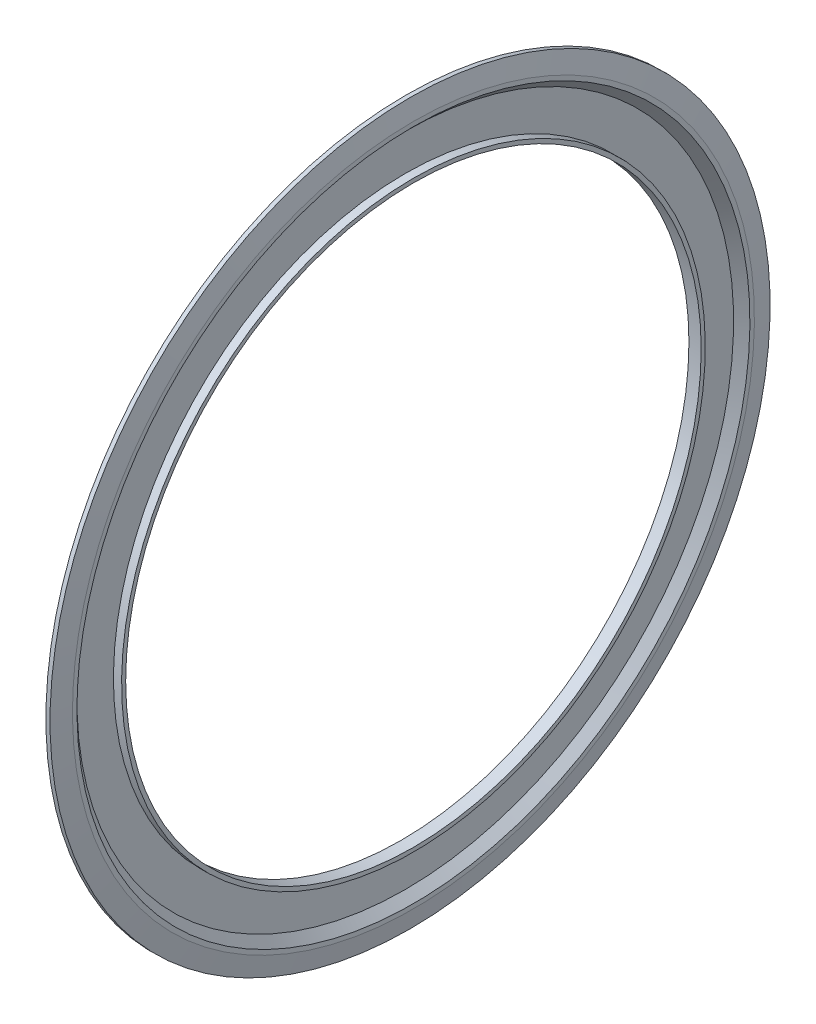
ISO-10303-21;
HEADER;
FILE_DESCRIPTION(('STEP AP214'),'2;1');
FILE_NAME('part.step','',(''),(''),'','','');
FILE_SCHEMA(('AUTOMOTIVE_DESIGN { 1 0 10303 214 1 1 1 1 }'));
ENDSEC;
DATA;
#1=APPLICATION_CONTEXT('core data for automotive mechanical design processes');
#2=APPLICATION_PROTOCOL_DEFINITION('international standard','automotive_design',2000,#1);
#3=PRODUCT_CONTEXT('',#1,'mechanical');
#4=PRODUCT('Part','Part','',(#3));
#5=PRODUCT_RELATED_PRODUCT_CATEGORY('part','',(#4));
#6=PRODUCT_DEFINITION_FORMATION('','',#4);
#7=PRODUCT_DEFINITION_CONTEXT('part definition',#1,'design');
#8=PRODUCT_DEFINITION('design','',#6,#7);
#9=PRODUCT_DEFINITION_SHAPE('','',#8);
#10=(LENGTH_UNIT() NAMED_UNIT(*) SI_UNIT(.MILLI.,.METRE.));
#11=(NAMED_UNIT(*) PLANE_ANGLE_UNIT() SI_UNIT($,.RADIAN.));
#12=(NAMED_UNIT(*) SI_UNIT($,.STERADIAN.) SOLID_ANGLE_UNIT());
#13=UNCERTAINTY_MEASURE_WITH_UNIT(LENGTH_MEASURE(1.E-05),#10,'distance_accuracy_value','');
#14=(GEOMETRIC_REPRESENTATION_CONTEXT(3) GLOBAL_UNCERTAINTY_ASSIGNED_CONTEXT((#13)) GLOBAL_UNIT_ASSIGNED_CONTEXT((#10,
#11,#12)) REPRESENTATION_CONTEXT('',''));
#15=CARTESIAN_POINT('',(0.,0.,0.));
#16=DIRECTION('',(0.,0.,1.));
#17=DIRECTION('',(1.,0.,0.));
#18=AXIS2_PLACEMENT_3D('',#15,#16,#17);
#19=CARTESIAN_POINT('',(0.498800475508444,10.58,0.));
#20=DIRECTION('',(1.,0.,0.));
#21=DIRECTION('',(0.,-1.,0.));
#22=AXIS2_PLACEMENT_3D('',#19,#20,#21);
#23=PLANE('',#22);
#24=CARTESIAN_POINT('',(0.498800475508444,0.,0.));
#25=DIRECTION('',(-1.,0.,0.));
#26=DIRECTION('',(0.,1.,0.));
#27=AXIS2_PLACEMENT_3D('',#24,#25,#26);
#28=CIRCLE('',#27,10.51);
#29=CARTESIAN_POINT('',(0.498800475508444,10.51,0.));
#30=VERTEX_POINT('',#29);
#31=EDGE_CURVE('E11',#30,#30,#28,.T.);
#32=ORIENTED_EDGE('',*,*,#31,.T.);
#33=EDGE_LOOP('',(#32));
#34=FACE_BOUND('',#33,.T.);
#35=CARTESIAN_POINT('',(0.498800475508444,0.,0.));
#36=DIRECTION('',(-1.,0.,0.));
#37=DIRECTION('',(0.,1.,0.));
#38=AXIS2_PLACEMENT_3D('',#35,#36,#37);
#39=CIRCLE('',#38,10.65);
#40=CARTESIAN_POINT('',(0.498800475508444,10.65,0.));
#41=VERTEX_POINT('',#40);
#42=EDGE_CURVE('E70',#41,#41,#39,.T.);
#43=ORIENTED_EDGE('',*,*,#42,.F.);
#44=EDGE_LOOP('',(#43));
#45=FACE_BOUND('',#44,.T.);
#46=ADVANCED_FACE('F16',(#34,#45),#23,.T.);
#47=CARTESIAN_POINT('',(0.371300475508445,0.,0.));
#48=DIRECTION('',(1.,0.,0.));
#49=DIRECTION('',(0.,1.,0.));
#50=AXIS2_PLACEMENT_3D('',#47,#48,#49);
#51=CONICAL_SURFACE('',#50,10.3825,0.785398163397449);
#52=CARTESIAN_POINT('',(0.243800475508445,0.,0.));
#53=DIRECTION('',(-1.,0.,0.));
#54=DIRECTION('',(0.,1.,0.));
#55=AXIS2_PLACEMENT_3D('',#52,#53,#54);
#56=CIRCLE('',#55,10.255);
#57=CARTESIAN_POINT('',(0.243800475508445,10.255,0.));
#58=VERTEX_POINT('',#57);
#59=EDGE_CURVE('E25',#58,#58,#56,.T.);
#60=ORIENTED_EDGE('',*,*,#59,.T.);
#61=EDGE_LOOP('',(#60));
#62=FACE_BOUND('',#61,.T.);
#63=ORIENTED_EDGE('',*,*,#31,.F.);
#64=EDGE_LOOP('',(#63));
#65=FACE_BOUND('',#64,.T.);
#66=ADVANCED_FACE('F88',(#62,#65),#51,.F.);
#67=CARTESIAN_POINT('',(0.243800475508445,9.685,0.));
#68=DIRECTION('',(1.,0.,0.));
#69=DIRECTION('',(0.,-1.,0.));
#70=AXIS2_PLACEMENT_3D('',#67,#68,#69);
#71=PLANE('',#70);
#72=CARTESIAN_POINT('',(0.243800475508445,0.,0.));
#73=DIRECTION('',(-1.,0.,0.));
#74=DIRECTION('',(0.,1.,0.));
#75=AXIS2_PLACEMENT_3D('',#72,#73,#74);
#76=CIRCLE('',#75,9.115);
#77=CARTESIAN_POINT('',(0.243800475508445,9.115,0.));
#78=VERTEX_POINT('',#77);
#79=EDGE_CURVE('E55',#78,#78,#76,.T.);
#80=ORIENTED_EDGE('',*,*,#79,.T.);
#81=EDGE_LOOP('',(#80));
#82=FACE_BOUND('',#81,.T.);
#83=ORIENTED_EDGE('',*,*,#59,.F.);
#84=EDGE_LOOP('',(#83));
#85=FACE_BOUND('',#84,.T.);
#86=ADVANCED_FACE('F91',(#82,#85),#71,.T.);
#87=CARTESIAN_POINT('',(0.371300475508445,0.,0.));
#88=DIRECTION('',(1.,0.,0.));
#89=DIRECTION('',(0.,1.,0.));
#90=AXIS2_PLACEMENT_3D('',#87,#88,#89);
#91=CYLINDRICAL_SURFACE('',#90,9.115);
#92=CARTESIAN_POINT('',(0.498800475508444,0.,0.));
#93=DIRECTION('',(-1.,0.,0.));
#94=DIRECTION('',(0.,1.,0.));
#95=AXIS2_PLACEMENT_3D('',#92,#93,#94);
#96=CIRCLE('',#95,9.115);
#97=CARTESIAN_POINT('',(0.498800475508444,9.115,0.));
#98=VERTEX_POINT('',#97);
#99=EDGE_CURVE('E59',#98,#98,#96,.T.);
#100=ORIENTED_EDGE('',*,*,#99,.T.);
#101=EDGE_LOOP('',(#100));
#102=FACE_BOUND('',#101,.T.);
#103=ORIENTED_EDGE('',*,*,#79,.F.);
#104=EDGE_LOOP('',(#103));
#105=FACE_BOUND('',#104,.T.);
#106=ADVANCED_FACE('F93',(#102,#105),#91,.T.);
#107=CARTESIAN_POINT('',(0.498800475508444,9.05125,0.));
#108=DIRECTION('',(1.,0.,0.));
#109=DIRECTION('',(0.,-1.,0.));
#110=AXIS2_PLACEMENT_3D('',#107,#108,#109);
#111=PLANE('',#110);
#112=CARTESIAN_POINT('',(0.498800475508444,0.,0.));
#113=DIRECTION('',(-1.,0.,0.));
#114=DIRECTION('',(0.,1.,0.));
#115=AXIS2_PLACEMENT_3D('',#112,#113,#114);
#116=CIRCLE('',#115,8.9875);
#117=CARTESIAN_POINT('',(0.498800475508444,8.9875,0.));
#118=VERTEX_POINT('',#117);
#119=EDGE_CURVE('E83',#118,#118,#116,.T.);
#120=ORIENTED_EDGE('',*,*,#119,.T.);
#121=EDGE_LOOP('',(#120));
#122=FACE_BOUND('',#121,.T.);
#123=ORIENTED_EDGE('',*,*,#99,.F.);
#124=EDGE_LOOP('',(#123));
#125=FACE_BOUND('',#124,.T.);
#126=ADVANCED_FACE('F100',(#122,#125),#111,.T.);
#127=CARTESIAN_POINT('',(0.307550475508445,0.,0.));
#128=DIRECTION('',(1.,0.,0.));
#129=DIRECTION('',(0.,1.,0.));
#130=AXIS2_PLACEMENT_3D('',#127,#128,#129);
#131=CYLINDRICAL_SURFACE('',#130,8.9875);
#132=CARTESIAN_POINT('',(0.116300475508445,0.,0.));
#133=DIRECTION('',(-1.,0.,0.));
#134=DIRECTION('',(0.,1.,0.));
#135=AXIS2_PLACEMENT_3D('',#132,#133,#134);
#136=CIRCLE('',#135,8.9875);
#137=CARTESIAN_POINT('',(0.116300475508445,8.9875,0.));
#138=VERTEX_POINT('',#137);
#139=EDGE_CURVE('E81',#138,#138,#136,.T.);
#140=ORIENTED_EDGE('',*,*,#139,.T.);
#141=EDGE_LOOP('',(#140));
#142=FACE_BOUND('',#141,.T.);
#143=ORIENTED_EDGE('',*,*,#119,.F.);
#144=EDGE_LOOP('',(#143));
#145=FACE_BOUND('',#144,.T.);
#146=ADVANCED_FACE('F135',(#142,#145),#131,.F.);
#147=CARTESIAN_POINT('',(0.116300475508446,9.64765611460129,0.));
#148=DIRECTION('',(-1.,0.,0.));
#149=DIRECTION('',(0.,1.,0.));
#150=AXIS2_PLACEMENT_3D('',#147,#148,#149);
#151=PLANE('',#150);
#152=CARTESIAN_POINT('',(0.116300475508446,0.,0.));
#153=DIRECTION('',(-1.,0.,0.));
#154=DIRECTION('',(0.,1.,0.));
#155=AXIS2_PLACEMENT_3D('',#152,#153,#154);
#156=CIRCLE('',#155,10.3078122292026);
#157=CARTESIAN_POINT('',(0.116300475508446,10.3078122292026,0.));
#158=VERTEX_POINT('',#157);
#159=EDGE_CURVE('E84',#158,#158,#156,.T.);
#160=ORIENTED_EDGE('',*,*,#159,.T.);
#161=EDGE_LOOP('',(#160));
#162=FACE_BOUND('',#161,.T.);
#163=ORIENTED_EDGE('',*,*,#139,.F.);
#164=EDGE_LOOP('',(#163));
#165=FACE_BOUND('',#164,.T.);
#166=ADVANCED_FACE('F145',(#162,#165),#151,.T.);
#167=CARTESIAN_POINT('',(0.243800475508445,0.,0.));
#168=DIRECTION('',(1.,0.,0.));
#169=DIRECTION('',(0.,1.,0.));
#170=AXIS2_PLACEMENT_3D('',#167,#168,#169);
#171=CONICAL_SURFACE('',#170,10.4353122292026,0.785398163397449);
#172=CARTESIAN_POINT('',(0.371300475508445,0.,0.));
#173=DIRECTION('',(-1.,0.,0.));
#174=DIRECTION('',(0.,1.,0.));
#175=AXIS2_PLACEMENT_3D('',#172,#173,#174);
#176=CIRCLE('',#175,10.5628122292026);
#177=CARTESIAN_POINT('',(0.371300475508445,10.5628122292026,0.));
#178=VERTEX_POINT('',#177);
#179=EDGE_CURVE('E210',#178,#178,#176,.T.);
#180=ORIENTED_EDGE('',*,*,#179,.T.);
#181=EDGE_LOOP('',(#180));
#182=FACE_BOUND('',#181,.T.);
#183=ORIENTED_EDGE('',*,*,#159,.F.);
#184=EDGE_LOOP('',(#183));
#185=FACE_BOUND('',#184,.T.);
#186=ADVANCED_FACE('F155',(#182,#185),#171,.T.);
#187=CARTESIAN_POINT('',(0.371300475508445,10.6008287123015,0.));
#188=DIRECTION('',(-1.,0.,0.));
#189=DIRECTION('',(0.,1.,0.));
#190=AXIS2_PLACEMENT_3D('',#187,#188,#189);
#191=PLANE('',#190);
#192=CARTESIAN_POINT('',(0.371300475508445,0.,0.));
#193=DIRECTION('',(-1.,0.,0.));
#194=DIRECTION('',(0.,1.,0.));
#195=AXIS2_PLACEMENT_3D('',#192,#193,#194);
#196=CIRCLE('',#195,10.6388451954004);
#197=CARTESIAN_POINT('',(0.371300475508445,10.6388451954004,0.));
#198=VERTEX_POINT('',#197);
#199=EDGE_CURVE('E19',#198,#198,#196,.T.);
#200=ORIENTED_EDGE('',*,*,#199,.T.);
#201=EDGE_LOOP('',(#200));
#202=FACE_BOUND('',#201,.T.);
#203=ORIENTED_EDGE('',*,*,#179,.F.);
#204=EDGE_LOOP('',(#203));
#205=FACE_BOUND('',#204,.T.);
#206=ADVANCED_FACE('F165',(#202,#205),#191,.T.);
#207=CARTESIAN_POINT('',(0.31785975223996,0.,0.));
#208=DIRECTION('',(-1.,0.,0.));
#209=DIRECTION('',(0.,1.,0.));
#210=AXIS2_PLACEMENT_3D('',#207,#208,#209);
#211=CONICAL_SURFACE('',#210,10.9419225977002,1.39626340159546);
#212=CARTESIAN_POINT('',(0.264419028971476,0.,0.));
#213=DIRECTION('',(-1.,0.,0.));
#214=DIRECTION('',(0.,1.,0.));
#215=AXIS2_PLACEMENT_3D('',#212,#213,#214);
#216=CIRCLE('',#215,11.245);
#217=CARTESIAN_POINT('',(0.264419028971476,11.245,0.));
#218=VERTEX_POINT('',#217);
#219=EDGE_CURVE('E66',#218,#218,#216,.T.);
#220=ORIENTED_EDGE('',*,*,#219,.T.);
#221=EDGE_LOOP('',(#220));
#222=FACE_BOUND('',#221,.T.);
#223=ORIENTED_EDGE('',*,*,#199,.F.);
#224=EDGE_LOOP('',(#223));
#225=FACE_BOUND('',#224,.T.);
#226=ADVANCED_FACE('F175',(#222,#225),#211,.F.);
#227=CARTESIAN_POINT('',(0.329152475479191,0.,0.));
#228=DIRECTION('',(1.,0.,0.));
#229=DIRECTION('',(0.,1.,0.));
#230=AXIS2_PLACEMENT_3D('',#227,#228,#229);
#231=CYLINDRICAL_SURFACE('',#230,11.245);
#232=CARTESIAN_POINT('',(0.393885921986908,0.,0.));
#233=DIRECTION('',(-1.,0.,0.));
#234=DIRECTION('',(0.,1.,0.));
#235=AXIS2_PLACEMENT_3D('',#232,#233,#234);
#236=CIRCLE('',#235,11.245);
#237=CARTESIAN_POINT('',(0.393885921986908,11.245,0.));
#238=VERTEX_POINT('',#237);
#239=EDGE_CURVE('E74',#238,#238,#236,.T.);
#240=ORIENTED_EDGE('',*,*,#239,.T.);
#241=EDGE_LOOP('',(#240));
#242=FACE_BOUND('',#241,.T.);
#243=ORIENTED_EDGE('',*,*,#219,.F.);
#244=EDGE_LOOP('',(#243));
#245=FACE_BOUND('',#244,.T.);
#246=ADVANCED_FACE('F185',(#242,#245),#231,.T.);
#247=CARTESIAN_POINT('',(0.446343198747676,0.,0.));
#248=DIRECTION('',(-1.,0.,0.));
#249=DIRECTION('',(0.,1.,0.));
#250=AXIS2_PLACEMENT_3D('',#247,#248,#249);
#251=CONICAL_SURFACE('',#250,10.9475,1.39626340159546);
#252=ORIENTED_EDGE('',*,*,#42,.T.);
#253=EDGE_LOOP('',(#252));
#254=FACE_BOUND('',#253,.T.);
#255=ORIENTED_EDGE('',*,*,#239,.F.);
#256=EDGE_LOOP('',(#255));
#257=FACE_BOUND('',#256,.T.);
#258=ADVANCED_FACE('F71',(#254,#257),#251,.T.);
#259=CLOSED_SHELL('',(#46,#66,#86,#106,#126,#146,#166,#186,#206,#226,#246,#258));
#260=MANIFOLD_SOLID_BREP('B1',#259);
#261=ADVANCED_BREP_SHAPE_REPRESENTATION('',(#18,#260),#14);
#262=SHAPE_DEFINITION_REPRESENTATION(#9,#261);
ENDSEC;
END-ISO-10303-21;
